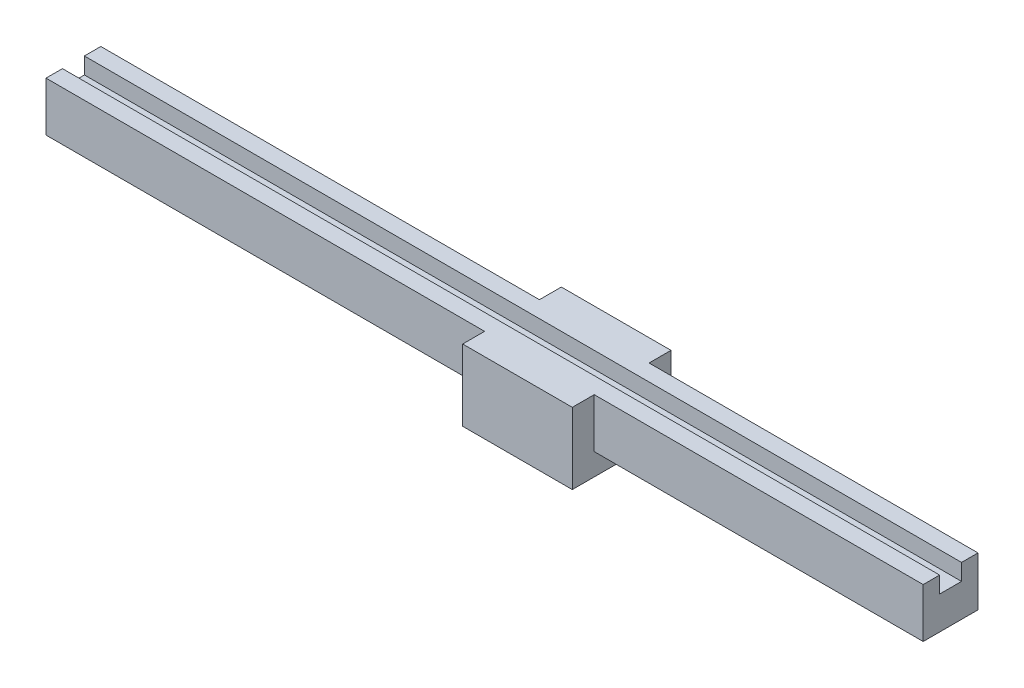
ISO-10303-21;
HEADER;
FILE_DESCRIPTION(('STEP AP214'),'2;1');
FILE_NAME('part.step','',(''),(''),'','','');
FILE_SCHEMA(('AUTOMOTIVE_DESIGN { 1 0 10303 214 1 1 1 1 }'));
ENDSEC;
DATA;
#1=APPLICATION_CONTEXT('core data for automotive mechanical design processes');
#2=APPLICATION_PROTOCOL_DEFINITION('international standard','automotive_design',2000,#1);
#3=PRODUCT_CONTEXT('',#1,'mechanical');
#4=PRODUCT('Part','Part','',(#3));
#5=PRODUCT_RELATED_PRODUCT_CATEGORY('part','',(#4));
#6=PRODUCT_DEFINITION_FORMATION('','',#4);
#7=PRODUCT_DEFINITION_CONTEXT('part definition',#1,'design');
#8=PRODUCT_DEFINITION('design','',#6,#7);
#9=PRODUCT_DEFINITION_SHAPE('','',#8);
#10=(LENGTH_UNIT() NAMED_UNIT(*) SI_UNIT(.MILLI.,.METRE.));
#11=(NAMED_UNIT(*) PLANE_ANGLE_UNIT() SI_UNIT($,.RADIAN.));
#12=(NAMED_UNIT(*) SI_UNIT($,.STERADIAN.) SOLID_ANGLE_UNIT());
#13=UNCERTAINTY_MEASURE_WITH_UNIT(LENGTH_MEASURE(1.E-05),#10,'distance_accuracy_value','');
#14=(GEOMETRIC_REPRESENTATION_CONTEXT(3) GLOBAL_UNCERTAINTY_ASSIGNED_CONTEXT((#13)) GLOBAL_UNIT_ASSIGNED_CONTEXT((#10,
#11,#12)) REPRESENTATION_CONTEXT('',''));
#15=CARTESIAN_POINT('',(0.,0.,0.));
#16=DIRECTION('',(0.,0.,1.));
#17=DIRECTION('',(1.,0.,0.));
#18=AXIS2_PLACEMENT_3D('',#15,#16,#17);
#19=CARTESIAN_POINT('',(20.,-1.125,-1.25));
#20=DIRECTION('',(0.,0.,1.));
#21=DIRECTION('',(1.,0.,0.));
#22=AXIS2_PLACEMENT_3D('',#19,#20,#21);
#23=PLANE('',#22);
#24=DIRECTION('',(0.,-1.,0.));
#25=VECTOR('',#24,1.);
#26=CARTESIAN_POINT('',(0.,-1.125,-1.25));
#27=LINE('',#26,#25);
#28=CARTESIAN_POINT('',(0.,1.125,-1.25));
#29=VERTEX_POINT('',#28);
#30=CARTESIAN_POINT('',(0.,-1.125,-1.25));
#31=VERTEX_POINT('',#30);
#32=EDGE_CURVE('E200',#29,#31,#27,.T.);
#33=ORIENTED_EDGE('',*,*,#32,.T.);
#34=DIRECTION('',(-1.,0.,0.));
#35=VECTOR('',#34,1.);
#36=CARTESIAN_POINT('',(20.,-1.125,-1.25));
#37=LINE('',#36,#35);
#38=CARTESIAN_POINT('',(-20.,-1.125,-1.25));
#39=VERTEX_POINT('',#38);
#40=EDGE_CURVE('E248',#31,#39,#37,.T.);
#41=ORIENTED_EDGE('',*,*,#40,.T.);
#42=DIRECTION('',(0.,1.,0.));
#43=VECTOR('',#42,1.);
#44=CARTESIAN_POINT('',(-20.,-1.125,-1.25));
#45=LINE('',#44,#43);
#46=CARTESIAN_POINT('',(-20.,1.125,-1.25));
#47=VERTEX_POINT('',#46);
#48=EDGE_CURVE('E229',#39,#47,#45,.T.);
#49=ORIENTED_EDGE('',*,*,#48,.T.);
#50=DIRECTION('',(-1.,0.,0.));
#51=VECTOR('',#50,1.);
#52=CARTESIAN_POINT('',(20.,1.125,-1.25));
#53=LINE('',#52,#51);
#54=EDGE_CURVE('E43',#29,#47,#53,.T.);
#55=ORIENTED_EDGE('',*,*,#54,.F.);
#56=EDGE_LOOP('',(#33,#41,#49,#55));
#57=FACE_BOUND('',#56,.T.);
#58=ADVANCED_FACE('F35',(#57),#23,.F.);
#59=CARTESIAN_POINT('',(20.,-1.125,1.25));
#60=DIRECTION('',(0.,0.,-1.));
#61=DIRECTION('',(-1.,0.,0.));
#62=AXIS2_PLACEMENT_3D('',#59,#60,#61);
#63=PLANE('',#62);
#64=DIRECTION('',(0.,1.,0.));
#65=VECTOR('',#64,1.);
#66=CARTESIAN_POINT('',(0.,1.125,1.25));
#67=LINE('',#66,#65);
#68=CARTESIAN_POINT('',(0.,-1.125,1.25));
#69=VERTEX_POINT('',#68);
#70=CARTESIAN_POINT('',(0.,1.125,1.25));
#71=VERTEX_POINT('',#70);
#72=EDGE_CURVE('E189',#69,#71,#67,.T.);
#73=ORIENTED_EDGE('',*,*,#72,.T.);
#74=DIRECTION('',(-1.,0.,0.));
#75=VECTOR('',#74,1.);
#76=CARTESIAN_POINT('',(20.,1.125,1.25));
#77=LINE('',#76,#75);
#78=CARTESIAN_POINT('',(-20.,1.125,1.25));
#79=VERTEX_POINT('',#78);
#80=EDGE_CURVE('E264',#71,#79,#77,.T.);
#81=ORIENTED_EDGE('',*,*,#80,.T.);
#82=DIRECTION('',(0.,-1.,0.));
#83=VECTOR('',#82,1.);
#84=CARTESIAN_POINT('',(-20.,-1.125,1.25));
#85=LINE('',#84,#83);
#86=CARTESIAN_POINT('',(-20.,-1.125,1.25));
#87=VERTEX_POINT('',#86);
#88=EDGE_CURVE('E254',#79,#87,#85,.T.);
#89=ORIENTED_EDGE('',*,*,#88,.T.);
#90=DIRECTION('',(-1.,0.,0.));
#91=VECTOR('',#90,1.);
#92=CARTESIAN_POINT('',(20.,-1.125,1.25));
#93=LINE('',#92,#91);
#94=EDGE_CURVE('E261',#69,#87,#93,.T.);
#95=ORIENTED_EDGE('',*,*,#94,.F.);
#96=EDGE_LOOP('',(#73,#81,#89,#95));
#97=FACE_BOUND('',#96,.T.);
#98=ADVANCED_FACE('F270',(#97),#63,.F.);
#99=CARTESIAN_POINT('',(20.,-1.125,1.25));
#100=DIRECTION('',(0.,1.,0.));
#101=DIRECTION('',(0.,0.,1.));
#102=AXIS2_PLACEMENT_3D('',#99,#100,#101);
#103=PLANE('',#102);
#104=DIRECTION('',(0.,0.,1.));
#105=VECTOR('',#104,1.);
#106=CARTESIAN_POINT('',(0.,-1.125,1.25));
#107=LINE('',#106,#105);
#108=EDGE_CURVE('E202',#31,#69,#107,.T.);
#109=ORIENTED_EDGE('',*,*,#108,.T.);
#110=ORIENTED_EDGE('',*,*,#94,.T.);
#111=DIRECTION('',(0.,0.,-1.));
#112=VECTOR('',#111,1.);
#113=CARTESIAN_POINT('',(-20.,-1.125,1.25));
#114=LINE('',#113,#112);
#115=EDGE_CURVE('E240',#87,#39,#114,.T.);
#116=ORIENTED_EDGE('',*,*,#115,.T.);
#117=ORIENTED_EDGE('',*,*,#40,.F.);
#118=EDGE_LOOP('',(#109,#110,#116,#117));
#119=FACE_BOUND('',#118,.T.);
#120=ADVANCED_FACE('F282',(#119),#103,.F.);
#121=CARTESIAN_POINT('',(20.,1.125,1.25));
#122=DIRECTION('',(0.,-1.,0.));
#123=DIRECTION('',(0.,0.,-1.));
#124=AXIS2_PLACEMENT_3D('',#121,#122,#123);
#125=PLANE('',#124);
#126=DIRECTION('',(0.,0.,1.));
#127=VECTOR('',#126,1.);
#128=CARTESIAN_POINT('',(-20.,1.125,1.25));
#129=LINE('',#128,#127);
#130=CARTESIAN_POINT('',(-20.,1.125,-0.5));
#131=VERTEX_POINT('',#130);
#132=EDGE_CURVE('E251',#47,#131,#129,.T.);
#133=ORIENTED_EDGE('',*,*,#132,.T.);
#134=DIRECTION('',(1.,0.,0.));
#135=VECTOR('',#134,1.);
#136=CARTESIAN_POINT('',(-20.,1.125,-0.5));
#137=LINE('',#136,#135);
#138=CARTESIAN_POINT('',(20.,1.125,-0.5));
#139=VERTEX_POINT('',#138);
#140=EDGE_CURVE('E226',#131,#139,#137,.T.);
#141=ORIENTED_EDGE('',*,*,#140,.T.);
#142=DIRECTION('',(0.,0.,1.));
#143=VECTOR('',#142,1.);
#144=CARTESIAN_POINT('',(20.,1.125,1.25));
#145=LINE('',#144,#143);
#146=CARTESIAN_POINT('',(20.,1.125,-1.25));
#147=VERTEX_POINT('',#146);
#148=EDGE_CURVE('E241',#147,#139,#145,.T.);
#149=ORIENTED_EDGE('',*,*,#148,.F.);
#150=CARTESIAN_POINT('',(5.,1.125,-1.25));
#151=VERTEX_POINT('',#150);
#152=EDGE_CURVE('E11',#147,#151,#53,.T.);
#153=ORIENTED_EDGE('',*,*,#152,.T.);
#154=DIRECTION('',(0.,0.,1.));
#155=VECTOR('',#154,1.);
#156=CARTESIAN_POINT('',(5.,1.125,-1.25));
#157=LINE('',#156,#155);
#158=CARTESIAN_POINT('',(5.,1.125,-2.25));
#159=VERTEX_POINT('',#158);
#160=EDGE_CURVE('E182',#159,#151,#157,.T.);
#161=ORIENTED_EDGE('',*,*,#160,.F.);
#162=DIRECTION('',(-1.,0.,0.));
#163=VECTOR('',#162,1.);
#164=CARTESIAN_POINT('',(5.,1.125,-2.25));
#165=LINE('',#164,#163);
#166=CARTESIAN_POINT('',(0.,1.125,-2.25));
#167=VERTEX_POINT('',#166);
#168=EDGE_CURVE('E188',#159,#167,#165,.T.);
#169=ORIENTED_EDGE('',*,*,#168,.T.);
#170=DIRECTION('',(0.,0.,1.));
#171=VECTOR('',#170,1.);
#172=CARTESIAN_POINT('',(0.,1.125,-1.25));
#173=LINE('',#172,#171);
#174=EDGE_CURVE('E198',#167,#29,#173,.T.);
#175=ORIENTED_EDGE('',*,*,#174,.T.);
#176=ORIENTED_EDGE('',*,*,#54,.T.);
#177=EDGE_LOOP('',(#133,#141,#149,#153,#161,#169,#175,#176));
#178=FACE_BOUND('',#177,.T.);
#179=ADVANCED_FACE('F299',(#178),#125,.F.);
#180=CARTESIAN_POINT('',(20.,-1.125,-1.25));
#181=VERTEX_POINT('',#180);
#182=CARTESIAN_POINT('',(5.,-1.125,-1.25));
#183=VERTEX_POINT('',#182);
#184=EDGE_CURVE('E259',#181,#183,#37,.T.);
#185=ORIENTED_EDGE('',*,*,#184,.T.);
#186=DIRECTION('',(0.,-1.,0.));
#187=VECTOR('',#186,1.);
#188=CARTESIAN_POINT('',(5.,-1.125,-1.25));
#189=LINE('',#188,#187);
#190=EDGE_CURVE('E57',#151,#183,#189,.T.);
#191=ORIENTED_EDGE('',*,*,#190,.F.);
#192=ORIENTED_EDGE('',*,*,#152,.F.);
#193=DIRECTION('',(0.,1.,0.));
#194=VECTOR('',#193,1.);
#195=CARTESIAN_POINT('',(20.,-1.125,-1.25));
#196=LINE('',#195,#194);
#197=EDGE_CURVE('E236',#181,#147,#196,.T.);
#198=ORIENTED_EDGE('',*,*,#197,.F.);
#199=EDGE_LOOP('',(#185,#191,#192,#198));
#200=FACE_BOUND('',#199,.T.);
#201=ADVANCED_FACE('F37',(#200),#23,.F.);
#202=CARTESIAN_POINT('',(20.,1.125,0.5));
#203=VERTEX_POINT('',#202);
#204=CARTESIAN_POINT('',(20.,1.125,1.25));
#205=VERTEX_POINT('',#204);
#206=EDGE_CURVE('E239',#203,#205,#145,.T.);
#207=ORIENTED_EDGE('',*,*,#206,.F.);
#208=DIRECTION('',(1.,0.,0.));
#209=VECTOR('',#208,1.);
#210=CARTESIAN_POINT('',(-20.,1.125,0.5));
#211=LINE('',#210,#209);
#212=CARTESIAN_POINT('',(-20.,1.125,0.5));
#213=VERTEX_POINT('',#212);
#214=EDGE_CURVE('E232',#213,#203,#211,.T.);
#215=ORIENTED_EDGE('',*,*,#214,.F.);
#216=EDGE_CURVE('E250',#213,#79,#129,.T.);
#217=ORIENTED_EDGE('',*,*,#216,.T.);
#218=ORIENTED_EDGE('',*,*,#80,.F.);
#219=DIRECTION('',(0.,0.,1.));
#220=VECTOR('',#219,1.);
#221=CARTESIAN_POINT('',(0.,1.125,2.25));
#222=LINE('',#221,#220);
#223=CARTESIAN_POINT('',(0.,1.125,2.25));
#224=VERTEX_POINT('',#223);
#225=EDGE_CURVE('E166',#71,#224,#222,.T.);
#226=ORIENTED_EDGE('',*,*,#225,.T.);
#227=DIRECTION('',(-1.,0.,0.));
#228=VECTOR('',#227,1.);
#229=CARTESIAN_POINT('',(5.,1.125,2.25));
#230=LINE('',#229,#228);
#231=CARTESIAN_POINT('',(5.,1.125,2.25));
#232=VERTEX_POINT('',#231);
#233=EDGE_CURVE('E161',#232,#224,#230,.T.);
#234=ORIENTED_EDGE('',*,*,#233,.F.);
#235=DIRECTION('',(0.,0.,1.));
#236=VECTOR('',#235,1.);
#237=CARTESIAN_POINT('',(5.,1.125,2.25));
#238=LINE('',#237,#236);
#239=CARTESIAN_POINT('',(5.,1.125,1.25));
#240=VERTEX_POINT('',#239);
#241=EDGE_CURVE('E149',#240,#232,#238,.T.);
#242=ORIENTED_EDGE('',*,*,#241,.F.);
#243=EDGE_CURVE('E265',#205,#240,#77,.T.);
#244=ORIENTED_EDGE('',*,*,#243,.F.);
#245=EDGE_LOOP('',(#207,#215,#217,#218,#226,#234,#242,#244));
#246=FACE_BOUND('',#245,.T.);
#247=ADVANCED_FACE('F163',(#246),#125,.F.);
#248=ORIENTED_EDGE('',*,*,#243,.T.);
#249=DIRECTION('',(0.,1.,0.));
#250=VECTOR('',#249,1.);
#251=CARTESIAN_POINT('',(5.,1.125,1.25));
#252=LINE('',#251,#250);
#253=CARTESIAN_POINT('',(5.,-1.125,1.25));
#254=VERTEX_POINT('',#253);
#255=EDGE_CURVE('E156',#254,#240,#252,.T.);
#256=ORIENTED_EDGE('',*,*,#255,.F.);
#257=CARTESIAN_POINT('',(20.,-1.125,1.25));
#258=VERTEX_POINT('',#257);
#259=EDGE_CURVE('E262',#258,#254,#93,.T.);
#260=ORIENTED_EDGE('',*,*,#259,.F.);
#261=DIRECTION('',(0.,-1.,0.));
#262=VECTOR('',#261,1.);
#263=CARTESIAN_POINT('',(20.,-1.125,1.25));
#264=LINE('',#263,#262);
#265=EDGE_CURVE('E244',#205,#258,#264,.T.);
#266=ORIENTED_EDGE('',*,*,#265,.F.);
#267=EDGE_LOOP('',(#248,#256,#260,#266));
#268=FACE_BOUND('',#267,.T.);
#269=ADVANCED_FACE('F309',(#268),#63,.F.);
#270=ORIENTED_EDGE('',*,*,#259,.T.);
#271=DIRECTION('',(0.,0.,1.));
#272=VECTOR('',#271,1.);
#273=CARTESIAN_POINT('',(5.,-1.125,1.25));
#274=LINE('',#273,#272);
#275=EDGE_CURVE('E186',#183,#254,#274,.T.);
#276=ORIENTED_EDGE('',*,*,#275,.F.);
#277=ORIENTED_EDGE('',*,*,#184,.F.);
#278=DIRECTION('',(0.,0.,-1.));
#279=VECTOR('',#278,1.);
#280=CARTESIAN_POINT('',(20.,-1.125,1.25));
#281=LINE('',#280,#279);
#282=EDGE_CURVE('E246',#258,#181,#281,.T.);
#283=ORIENTED_EDGE('',*,*,#282,.F.);
#284=EDGE_LOOP('',(#270,#276,#277,#283));
#285=FACE_BOUND('',#284,.T.);
#286=ADVANCED_FACE('F308',(#285),#103,.F.);
#287=CARTESIAN_POINT('',(20.,0.,0.));
#288=DIRECTION('',(-1.,0.,0.));
#289=DIRECTION('',(0.,0.,1.));
#290=AXIS2_PLACEMENT_3D('',#287,#288,#289);
#291=PLANE('',#290);
#292=ORIENTED_EDGE('',*,*,#148,.T.);
#293=DIRECTION('',(0.,1.,0.));
#294=VECTOR('',#293,1.);
#295=CARTESIAN_POINT('',(20.,1.125,-0.5));
#296=LINE('',#295,#294);
#297=CARTESIAN_POINT('',(20.,0.375,-0.5));
#298=VERTEX_POINT('',#297);
#299=EDGE_CURVE('E169',#298,#139,#296,.T.);
#300=ORIENTED_EDGE('',*,*,#299,.F.);
#301=DIRECTION('',(0.,0.,-1.));
#302=VECTOR('',#301,1.);
#303=CARTESIAN_POINT('',(20.,0.375,0.5));
#304=LINE('',#303,#302);
#305=CARTESIAN_POINT('',(20.,0.375,0.5));
#306=VERTEX_POINT('',#305);
#307=EDGE_CURVE('E214',#306,#298,#304,.T.);
#308=ORIENTED_EDGE('',*,*,#307,.F.);
#309=DIRECTION('',(0.,-1.,0.));
#310=VECTOR('',#309,1.);
#311=CARTESIAN_POINT('',(20.,1.125,0.5));
#312=LINE('',#311,#310);
#313=EDGE_CURVE('E211',#203,#306,#312,.T.);
#314=ORIENTED_EDGE('',*,*,#313,.F.);
#315=ORIENTED_EDGE('',*,*,#206,.T.);
#316=ORIENTED_EDGE('',*,*,#265,.T.);
#317=ORIENTED_EDGE('',*,*,#282,.T.);
#318=ORIENTED_EDGE('',*,*,#197,.T.);
#319=EDGE_LOOP('',(#292,#300,#308,#314,#315,#316,#317,#318));
#320=FACE_BOUND('',#319,.T.);
#321=ADVANCED_FACE('F303',(#320),#291,.F.);
#322=CARTESIAN_POINT('',(-20.,0.,0.));
#323=DIRECTION('',(-1.,0.,0.));
#324=DIRECTION('',(0.,0.,1.));
#325=AXIS2_PLACEMENT_3D('',#322,#323,#324);
#326=PLANE('',#325);
#327=DIRECTION('',(0.,1.,0.));
#328=VECTOR('',#327,1.);
#329=CARTESIAN_POINT('',(-20.,1.125,-0.5));
#330=LINE('',#329,#328);
#331=CARTESIAN_POINT('',(-20.,0.375,-0.5));
#332=VERTEX_POINT('',#331);
#333=EDGE_CURVE('E217',#332,#131,#330,.T.);
#334=ORIENTED_EDGE('',*,*,#333,.T.);
#335=ORIENTED_EDGE('',*,*,#132,.F.);
#336=ORIENTED_EDGE('',*,*,#48,.F.);
#337=ORIENTED_EDGE('',*,*,#115,.F.);
#338=ORIENTED_EDGE('',*,*,#88,.F.);
#339=ORIENTED_EDGE('',*,*,#216,.F.);
#340=DIRECTION('',(0.,-1.,0.));
#341=VECTOR('',#340,1.);
#342=CARTESIAN_POINT('',(-20.,1.125,0.5));
#343=LINE('',#342,#341);
#344=CARTESIAN_POINT('',(-20.,0.375,0.5));
#345=VERTEX_POINT('',#344);
#346=EDGE_CURVE('E220',#213,#345,#343,.T.);
#347=ORIENTED_EDGE('',*,*,#346,.T.);
#348=DIRECTION('',(0.,0.,-1.));
#349=VECTOR('',#348,1.);
#350=CARTESIAN_POINT('',(-20.,0.375,0.5));
#351=LINE('',#350,#349);
#352=EDGE_CURVE('E223',#345,#332,#351,.T.);
#353=ORIENTED_EDGE('',*,*,#352,.T.);
#354=EDGE_LOOP('',(#334,#335,#336,#337,#338,#339,#347,#353));
#355=FACE_BOUND('',#354,.T.);
#356=ADVANCED_FACE('F278',(#355),#326,.T.);
#357=CARTESIAN_POINT('',(-20.,1.125,-0.5));
#358=DIRECTION('',(0.,0.,-1.));
#359=DIRECTION('',(0.,1.,0.));
#360=AXIS2_PLACEMENT_3D('',#357,#358,#359);
#361=PLANE('',#360);
#362=ORIENTED_EDGE('',*,*,#140,.F.);
#363=ORIENTED_EDGE('',*,*,#333,.F.);
#364=DIRECTION('',(1.,0.,0.));
#365=VECTOR('',#364,1.);
#366=CARTESIAN_POINT('',(-20.,0.375,-0.5));
#367=LINE('',#366,#365);
#368=EDGE_CURVE('E227',#332,#298,#367,.T.);
#369=ORIENTED_EDGE('',*,*,#368,.T.);
#370=ORIENTED_EDGE('',*,*,#299,.T.);
#371=EDGE_LOOP('',(#362,#363,#369,#370));
#372=FACE_BOUND('',#371,.T.);
#373=ADVANCED_FACE('F333',(#372),#361,.F.);
#374=CARTESIAN_POINT('',(-20.,0.375,0.5));
#375=DIRECTION('',(0.,-1.,0.));
#376=DIRECTION('',(0.,0.,-1.));
#377=AXIS2_PLACEMENT_3D('',#374,#375,#376);
#378=PLANE('',#377);
#379=ORIENTED_EDGE('',*,*,#368,.F.);
#380=ORIENTED_EDGE('',*,*,#352,.F.);
#381=DIRECTION('',(1.,0.,0.));
#382=VECTOR('',#381,1.);
#383=CARTESIAN_POINT('',(-20.,0.375,0.5));
#384=LINE('',#383,#382);
#385=EDGE_CURVE('E230',#345,#306,#384,.T.);
#386=ORIENTED_EDGE('',*,*,#385,.T.);
#387=ORIENTED_EDGE('',*,*,#307,.T.);
#388=EDGE_LOOP('',(#379,#380,#386,#387));
#389=FACE_BOUND('',#388,.T.);
#390=ADVANCED_FACE('F338',(#389),#378,.F.);
#391=CARTESIAN_POINT('',(-20.,1.125,0.5));
#392=DIRECTION('',(0.,0.,1.));
#393=DIRECTION('',(0.,-1.,0.));
#394=AXIS2_PLACEMENT_3D('',#391,#392,#393);
#395=PLANE('',#394);
#396=ORIENTED_EDGE('',*,*,#385,.F.);
#397=ORIENTED_EDGE('',*,*,#346,.F.);
#398=ORIENTED_EDGE('',*,*,#214,.T.);
#399=ORIENTED_EDGE('',*,*,#313,.T.);
#400=EDGE_LOOP('',(#396,#397,#398,#399));
#401=FACE_BOUND('',#400,.T.);
#402=ADVANCED_FACE('F340',(#401),#395,.F.);
#403=CARTESIAN_POINT('',(5.,1.125,2.25));
#404=DIRECTION('',(0.,0.,-1.));
#405=DIRECTION('',(-1.,0.,0.));
#406=AXIS2_PLACEMENT_3D('',#403,#404,#405);
#407=PLANE('',#406);
#408=DIRECTION('',(0.,-1.,0.));
#409=VECTOR('',#408,1.);
#410=CARTESIAN_POINT('',(0.,1.125,2.25));
#411=LINE('',#410,#409);
#412=CARTESIAN_POINT('',(0.,-2.125,2.25));
#413=VERTEX_POINT('',#412);
#414=EDGE_CURVE('E192',#224,#413,#411,.T.);
#415=ORIENTED_EDGE('',*,*,#414,.T.);
#416=DIRECTION('',(-1.,0.,0.));
#417=VECTOR('',#416,1.);
#418=CARTESIAN_POINT('',(5.,-2.125,2.25));
#419=LINE('',#418,#417);
#420=CARTESIAN_POINT('',(5.,-2.125,2.25));
#421=VERTEX_POINT('',#420);
#422=EDGE_CURVE('E170',#421,#413,#419,.T.);
#423=ORIENTED_EDGE('',*,*,#422,.F.);
#424=DIRECTION('',(0.,-1.,0.));
#425=VECTOR('',#424,1.);
#426=CARTESIAN_POINT('',(5.,1.125,2.25));
#427=LINE('',#426,#425);
#428=EDGE_CURVE('E153',#232,#421,#427,.T.);
#429=ORIENTED_EDGE('',*,*,#428,.F.);
#430=ORIENTED_EDGE('',*,*,#233,.T.);
#431=EDGE_LOOP('',(#415,#423,#429,#430));
#432=FACE_BOUND('',#431,.T.);
#433=ADVANCED_FACE('F172',(#432),#407,.F.);
#434=CARTESIAN_POINT('',(5.,-2.125,2.25));
#435=DIRECTION('',(0.,1.,0.));
#436=DIRECTION('',(0.,0.,1.));
#437=AXIS2_PLACEMENT_3D('',#434,#435,#436);
#438=PLANE('',#437);
#439=DIRECTION('',(0.,0.,-1.));
#440=VECTOR('',#439,1.);
#441=CARTESIAN_POINT('',(0.,-2.125,2.25));
#442=LINE('',#441,#440);
#443=CARTESIAN_POINT('',(0.,-2.125,-2.25));
#444=VERTEX_POINT('',#443);
#445=EDGE_CURVE('E194',#413,#444,#442,.T.);
#446=ORIENTED_EDGE('',*,*,#445,.T.);
#447=DIRECTION('',(-1.,0.,0.));
#448=VECTOR('',#447,1.);
#449=CARTESIAN_POINT('',(5.,-2.125,-2.25));
#450=LINE('',#449,#448);
#451=CARTESIAN_POINT('',(5.,-2.125,-2.25));
#452=VERTEX_POINT('',#451);
#453=EDGE_CURVE('E206',#452,#444,#450,.T.);
#454=ORIENTED_EDGE('',*,*,#453,.F.);
#455=DIRECTION('',(0.,0.,-1.));
#456=VECTOR('',#455,1.);
#457=CARTESIAN_POINT('',(5.,-2.125,2.25));
#458=LINE('',#457,#456);
#459=EDGE_CURVE('E175',#421,#452,#458,.T.);
#460=ORIENTED_EDGE('',*,*,#459,.F.);
#461=ORIENTED_EDGE('',*,*,#422,.T.);
#462=EDGE_LOOP('',(#446,#454,#460,#461));
#463=FACE_BOUND('',#462,.T.);
#464=ADVANCED_FACE('F290',(#463),#438,.F.);
#465=CARTESIAN_POINT('',(5.,-2.125,-2.25));
#466=DIRECTION('',(0.,0.,1.));
#467=DIRECTION('',(1.,0.,0.));
#468=AXIS2_PLACEMENT_3D('',#465,#466,#467);
#469=PLANE('',#468);
#470=DIRECTION('',(0.,1.,0.));
#471=VECTOR('',#470,1.);
#472=CARTESIAN_POINT('',(0.,-2.125,-2.25));
#473=LINE('',#472,#471);
#474=EDGE_CURVE('E196',#444,#167,#473,.T.);
#475=ORIENTED_EDGE('',*,*,#474,.T.);
#476=ORIENTED_EDGE('',*,*,#168,.F.);
#477=DIRECTION('',(0.,1.,0.));
#478=VECTOR('',#477,1.);
#479=CARTESIAN_POINT('',(5.,-2.125,-2.25));
#480=LINE('',#479,#478);
#481=EDGE_CURVE('E177',#452,#159,#480,.T.);
#482=ORIENTED_EDGE('',*,*,#481,.F.);
#483=ORIENTED_EDGE('',*,*,#453,.T.);
#484=EDGE_LOOP('',(#475,#476,#482,#483));
#485=FACE_BOUND('',#484,.T.);
#486=ADVANCED_FACE('F296',(#485),#469,.F.);
#487=CARTESIAN_POINT('',(5.,0.,0.));
#488=DIRECTION('',(1.,0.,0.));
#489=DIRECTION('',(0.,0.,-1.));
#490=AXIS2_PLACEMENT_3D('',#487,#488,#489);
#491=PLANE('',#490);
#492=ORIENTED_EDGE('',*,*,#255,.T.);
#493=ORIENTED_EDGE('',*,*,#241,.T.);
#494=ORIENTED_EDGE('',*,*,#428,.T.);
#495=ORIENTED_EDGE('',*,*,#459,.T.);
#496=ORIENTED_EDGE('',*,*,#481,.T.);
#497=ORIENTED_EDGE('',*,*,#160,.T.);
#498=ORIENTED_EDGE('',*,*,#190,.T.);
#499=ORIENTED_EDGE('',*,*,#275,.T.);
#500=EDGE_LOOP('',(#492,#493,#494,#495,#496,#497,#498,#499));
#501=FACE_BOUND('',#500,.T.);
#502=ADVANCED_FACE('F151',(#501),#491,.T.);
#503=CARTESIAN_POINT('',(0.,0.,0.));
#504=DIRECTION('',(1.,0.,0.));
#505=DIRECTION('',(0.,0.,-1.));
#506=AXIS2_PLACEMENT_3D('',#503,#504,#505);
#507=PLANE('',#506);
#508=ORIENTED_EDGE('',*,*,#72,.F.);
#509=ORIENTED_EDGE('',*,*,#108,.F.);
#510=ORIENTED_EDGE('',*,*,#32,.F.);
#511=ORIENTED_EDGE('',*,*,#174,.F.);
#512=ORIENTED_EDGE('',*,*,#474,.F.);
#513=ORIENTED_EDGE('',*,*,#445,.F.);
#514=ORIENTED_EDGE('',*,*,#414,.F.);
#515=ORIENTED_EDGE('',*,*,#225,.F.);
#516=EDGE_LOOP('',(#508,#509,#510,#511,#512,#513,#514,#515));
#517=FACE_BOUND('',#516,.T.);
#518=ADVANCED_FACE('F285',(#517),#507,.F.);
#519=CLOSED_SHELL('',(#58,#98,#120,#179,#201,#247,#269,#286,#321,#356,#373,#390,#402,#433,#464,
#486,#502,#518));
#520=MANIFOLD_SOLID_BREP('B2',#519);
#521=ADVANCED_BREP_SHAPE_REPRESENTATION('',(#18,#520),#14);
#522=SHAPE_DEFINITION_REPRESENTATION(#9,#521);
ENDSEC;
END-ISO-10303-21;
